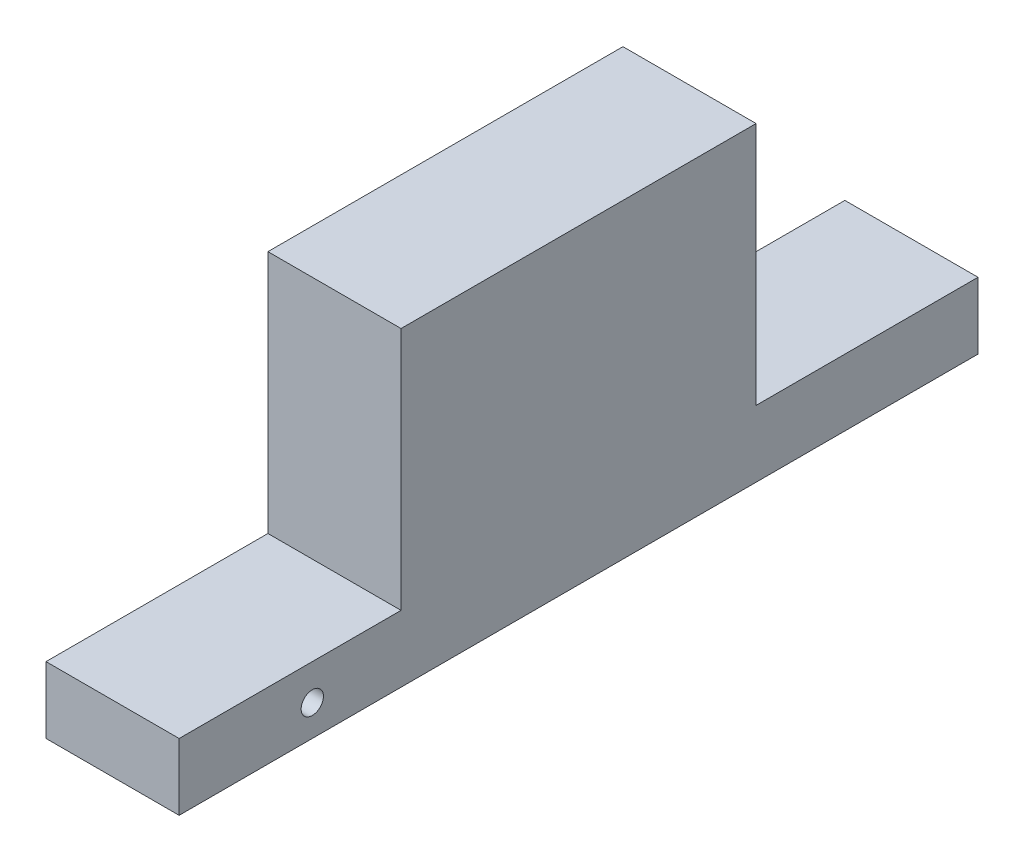
ISO-10303-21;
HEADER;
FILE_DESCRIPTION(('STEP AP214'),'2;1');
FILE_NAME('part.step','',(''),(''),'','','');
FILE_SCHEMA(('AUTOMOTIVE_DESIGN { 1 0 10303 214 1 1 1 1 }'));
ENDSEC;
DATA;
#1=APPLICATION_CONTEXT('core data for automotive mechanical design processes');
#2=APPLICATION_PROTOCOL_DEFINITION('international standard','automotive_design',2000,#1);
#3=PRODUCT_CONTEXT('',#1,'mechanical');
#4=PRODUCT('Part','Part','',(#3));
#5=PRODUCT_RELATED_PRODUCT_CATEGORY('part','',(#4));
#6=PRODUCT_DEFINITION_FORMATION('','',#4);
#7=PRODUCT_DEFINITION_CONTEXT('part definition',#1,'design');
#8=PRODUCT_DEFINITION('design','',#6,#7);
#9=PRODUCT_DEFINITION_SHAPE('','',#8);
#10=(LENGTH_UNIT() NAMED_UNIT(*) SI_UNIT(.MILLI.,.METRE.));
#11=(NAMED_UNIT(*) PLANE_ANGLE_UNIT() SI_UNIT($,.RADIAN.));
#12=(NAMED_UNIT(*) SI_UNIT($,.STERADIAN.) SOLID_ANGLE_UNIT());
#13=UNCERTAINTY_MEASURE_WITH_UNIT(LENGTH_MEASURE(1.E-05),#10,'distance_accuracy_value','');
#14=(GEOMETRIC_REPRESENTATION_CONTEXT(3) GLOBAL_UNCERTAINTY_ASSIGNED_CONTEXT((#13)) GLOBAL_UNIT_ASSIGNED_CONTEXT((#10,
#11,#12)) REPRESENTATION_CONTEXT('',''));
#15=CARTESIAN_POINT('',(0.,0.,0.));
#16=DIRECTION('',(0.,0.,1.));
#17=DIRECTION('',(1.,0.,0.));
#18=AXIS2_PLACEMENT_3D('',#15,#16,#17);
#19=CARTESIAN_POINT('',(208.132079158251,-35.000000000025,400000.));
#20=DIRECTION('',(0.,1.,0.));
#21=DIRECTION('',(0.,0.,1.));
#22=AXIS2_PLACEMENT_3D('',#19,#20,#21);
#23=PLANE('',#22);
#24=DIRECTION('',(0.,0.,-1.));
#25=VECTOR('',#24,1.);
#26=CARTESIAN_POINT('',(15.,-35.000000000025,400000.));
#27=LINE('',#26,#25);
#28=CARTESIAN_POINT('',(15.,-35.000000000025,89.999999999975));
#29=VERTEX_POINT('',#28);
#30=CARTESIAN_POINT('',(15.0000000000001,-35.000000000025,-89.999999999975));
#31=VERTEX_POINT('',#30);
#32=EDGE_CURVE('E131',#29,#31,#27,.T.);
#33=ORIENTED_EDGE('',*,*,#32,.F.);
#34=DIRECTION('',(-1.,0.,0.));
#35=VECTOR('',#34,1.);
#36=CARTESIAN_POINT('',(208.132079158251,-35.000000000025,89.999999999975));
#37=LINE('',#36,#35);
#38=CARTESIAN_POINT('',(-15.,-35.000000000025,89.999999999975));
#39=VERTEX_POINT('',#38);
#40=EDGE_CURVE('E36',#29,#39,#37,.T.);
#41=ORIENTED_EDGE('',*,*,#40,.T.);
#42=DIRECTION('',(0.,0.,-1.));
#43=VECTOR('',#42,1.);
#44=CARTESIAN_POINT('',(-15.,-35.000000000025,400000.));
#45=LINE('',#44,#43);
#46=CARTESIAN_POINT('',(-15.,-35.000000000025,-89.999999999975));
#47=VERTEX_POINT('',#46);
#48=EDGE_CURVE('E139',#39,#47,#45,.T.);
#49=ORIENTED_EDGE('',*,*,#48,.T.);
#50=DIRECTION('',(-1.,0.,0.));
#51=VECTOR('',#50,1.);
#52=CARTESIAN_POINT('',(208.132079158251,-35.000000000025,-89.999999999975));
#53=LINE('',#52,#51);
#54=EDGE_CURVE('E87',#31,#47,#53,.T.);
#55=ORIENTED_EDGE('',*,*,#54,.F.);
#56=EDGE_LOOP('',(#33,#41,#49,#55));
#57=FACE_BOUND('',#56,.T.);
#58=ADVANCED_FACE('F32',(#57),#23,.F.);
#59=CARTESIAN_POINT('',(208.132079158251,-291545.,-89.999999999975));
#60=DIRECTION('',(0.,0.,1.));
#61=DIRECTION('',(1.,0.,0.));
#62=AXIS2_PLACEMENT_3D('',#59,#60,#61);
#63=PLANE('',#62);
#64=DIRECTION('',(0.,1.,0.));
#65=VECTOR('',#64,1.);
#66=CARTESIAN_POINT('',(15.,-291545.,-89.999999999975));
#67=LINE('',#66,#65);
#68=CARTESIAN_POINT('',(15.0000000000001,-19.9999999999831,-89.999999999975));
#69=VERTEX_POINT('',#68);
#70=EDGE_CURVE('E94',#31,#69,#67,.T.);
#71=ORIENTED_EDGE('',*,*,#70,.F.);
#72=ORIENTED_EDGE('',*,*,#54,.T.);
#73=DIRECTION('',(0.,1.,0.));
#74=VECTOR('',#73,1.);
#75=CARTESIAN_POINT('',(-15.,-291545.,-89.999999999975));
#76=LINE('',#75,#74);
#77=CARTESIAN_POINT('',(-15.,-19.9999999999831,-89.999999999975));
#78=VERTEX_POINT('',#77);
#79=EDGE_CURVE('E138',#47,#78,#76,.T.);
#80=ORIENTED_EDGE('',*,*,#79,.T.);
#81=DIRECTION('',(-1.,0.,0.));
#82=VECTOR('',#81,1.);
#83=CARTESIAN_POINT('',(208.132079158251,-19.9999999999831,-89.999999999975));
#84=LINE('',#83,#82);
#85=EDGE_CURVE('E140',#69,#78,#84,.T.);
#86=ORIENTED_EDGE('',*,*,#85,.F.);
#87=EDGE_LOOP('',(#71,#72,#80,#86));
#88=FACE_BOUND('',#87,.T.);
#89=ADVANCED_FACE('F187',(#88),#63,.F.);
#90=CARTESIAN_POINT('',(208.132079158251,-20.0000000000387,400000.));
#91=DIRECTION('',(0.,-1.,0.));
#92=DIRECTION('',(0.,0.,-1.));
#93=AXIS2_PLACEMENT_3D('',#90,#91,#92);
#94=PLANE('',#93);
#95=DIRECTION('',(0.,0.,1.));
#96=VECTOR('',#95,1.);
#97=CARTESIAN_POINT('',(15.,-20.0000000000387,400000.));
#98=LINE('',#97,#96);
#99=CARTESIAN_POINT('',(15.0000000000001,-19.9999999999818,-40.0000000000405));
#100=VERTEX_POINT('',#99);
#101=EDGE_CURVE('E127',#69,#100,#98,.T.);
#102=ORIENTED_EDGE('',*,*,#101,.F.);
#103=ORIENTED_EDGE('',*,*,#85,.T.);
#104=DIRECTION('',(0.,0.,1.));
#105=VECTOR('',#104,1.);
#106=CARTESIAN_POINT('',(-15.,-20.0000000000387,400000.));
#107=LINE('',#106,#105);
#108=CARTESIAN_POINT('',(-15.,-19.9999999999818,-40.0000000000405));
#109=VERTEX_POINT('',#108);
#110=EDGE_CURVE('E142',#78,#109,#107,.T.);
#111=ORIENTED_EDGE('',*,*,#110,.T.);
#112=DIRECTION('',(-1.,0.,0.));
#113=VECTOR('',#112,1.);
#114=CARTESIAN_POINT('',(208.132079158251,-19.9999999999818,-40.0000000000405));
#115=LINE('',#114,#113);
#116=EDGE_CURVE('E143',#100,#109,#115,.T.);
#117=ORIENTED_EDGE('',*,*,#116,.F.);
#118=EDGE_LOOP('',(#102,#103,#111,#117));
#119=FACE_BOUND('',#118,.T.);
#120=ADVANCED_FACE('F191',(#119),#94,.F.);
#121=CARTESIAN_POINT('',(208.132079158251,-291545.,-40.0000000000773));
#122=DIRECTION('',(0.,0.,1.));
#123=DIRECTION('',(0.,-1.,0.));
#124=AXIS2_PLACEMENT_3D('',#121,#122,#123);
#125=PLANE('',#124);
#126=DIRECTION('',(0.,1.,0.));
#127=VECTOR('',#126,1.);
#128=CARTESIAN_POINT('',(15.,-291545.,-40.0000000000773));
#129=LINE('',#128,#127);
#130=CARTESIAN_POINT('',(15.0000000000001,35.000000000025,-40.0000000000205));
#131=VERTEX_POINT('',#130);
#132=EDGE_CURVE('E122',#100,#131,#129,.T.);
#133=ORIENTED_EDGE('',*,*,#132,.F.);
#134=ORIENTED_EDGE('',*,*,#116,.T.);
#135=DIRECTION('',(0.,1.,0.));
#136=VECTOR('',#135,1.);
#137=CARTESIAN_POINT('',(-15.,-291545.,-40.0000000000773));
#138=LINE('',#137,#136);
#139=CARTESIAN_POINT('',(-15.,35.000000000025,-40.0000000000205));
#140=VERTEX_POINT('',#139);
#141=EDGE_CURVE('E145',#109,#140,#138,.T.);
#142=ORIENTED_EDGE('',*,*,#141,.T.);
#143=DIRECTION('',(-1.,0.,0.));
#144=VECTOR('',#143,1.);
#145=CARTESIAN_POINT('',(208.132079158251,35.000000000025,-40.0000000000205));
#146=LINE('',#145,#144);
#147=EDGE_CURVE('E146',#131,#140,#146,.T.);
#148=ORIENTED_EDGE('',*,*,#147,.F.);
#149=EDGE_LOOP('',(#133,#134,#142,#148));
#150=FACE_BOUND('',#149,.T.);
#151=ADVANCED_FACE('F196',(#150),#125,.F.);
#152=CARTESIAN_POINT('',(208.132079158251,35.000000000025,400000.));
#153=DIRECTION('',(0.,-1.,0.));
#154=DIRECTION('',(0.,0.,-1.));
#155=AXIS2_PLACEMENT_3D('',#152,#153,#154);
#156=PLANE('',#155);
#157=DIRECTION('',(0.,0.,1.));
#158=VECTOR('',#157,1.);
#159=CARTESIAN_POINT('',(15.,35.000000000025,400000.));
#160=LINE('',#159,#158);
#161=CARTESIAN_POINT('',(15.0000000000001,35.000000000025,40.0000000000405));
#162=VERTEX_POINT('',#161);
#163=EDGE_CURVE('E120',#131,#162,#160,.T.);
#164=ORIENTED_EDGE('',*,*,#163,.F.);
#165=ORIENTED_EDGE('',*,*,#147,.T.);
#166=DIRECTION('',(0.,0.,1.));
#167=VECTOR('',#166,1.);
#168=CARTESIAN_POINT('',(-15.,35.000000000025,400000.));
#169=LINE('',#168,#167);
#170=CARTESIAN_POINT('',(-15.,35.000000000025,40.0000000000405));
#171=VERTEX_POINT('',#170);
#172=EDGE_CURVE('E148',#140,#171,#169,.T.);
#173=ORIENTED_EDGE('',*,*,#172,.T.);
#174=DIRECTION('',(-1.,0.,0.));
#175=VECTOR('',#174,1.);
#176=CARTESIAN_POINT('',(208.132079158251,35.000000000025,40.0000000000405));
#177=LINE('',#176,#175);
#178=EDGE_CURVE('E149',#162,#171,#177,.T.);
#179=ORIENTED_EDGE('',*,*,#178,.F.);
#180=EDGE_LOOP('',(#164,#165,#173,#179));
#181=FACE_BOUND('',#180,.T.);
#182=ADVANCED_FACE('F200',(#181),#156,.F.);
#183=CARTESIAN_POINT('',(208.132079158251,-291545.,40.0000000000773));
#184=DIRECTION('',(0.,0.,-1.));
#185=DIRECTION('',(0.,1.,0.));
#186=AXIS2_PLACEMENT_3D('',#183,#184,#185);
#187=PLANE('',#186);
#188=DIRECTION('',(0.,-1.,0.));
#189=VECTOR('',#188,1.);
#190=CARTESIAN_POINT('',(15.,-291545.,40.0000000000773));
#191=LINE('',#190,#189);
#192=CARTESIAN_POINT('',(15.0000000000001,-19.9999999999818,40.0000000000205));
#193=VERTEX_POINT('',#192);
#194=EDGE_CURVE('E41',#162,#193,#191,.T.);
#195=ORIENTED_EDGE('',*,*,#194,.F.);
#196=ORIENTED_EDGE('',*,*,#178,.T.);
#197=DIRECTION('',(0.,-1.,0.));
#198=VECTOR('',#197,1.);
#199=CARTESIAN_POINT('',(-15.,-291545.,40.0000000000773));
#200=LINE('',#199,#198);
#201=CARTESIAN_POINT('',(-15.,-19.9999999999818,40.0000000000205));
#202=VERTEX_POINT('',#201);
#203=EDGE_CURVE('E114',#171,#202,#200,.T.);
#204=ORIENTED_EDGE('',*,*,#203,.T.);
#205=DIRECTION('',(-1.,0.,0.));
#206=VECTOR('',#205,1.);
#207=CARTESIAN_POINT('',(208.132079158251,-19.9999999999818,40.0000000000205));
#208=LINE('',#207,#206);
#209=EDGE_CURVE('E105',#193,#202,#208,.T.);
#210=ORIENTED_EDGE('',*,*,#209,.F.);
#211=EDGE_LOOP('',(#195,#196,#204,#210));
#212=FACE_BOUND('',#211,.T.);
#213=ADVANCED_FACE('F111',(#212),#187,.F.);
#214=CARTESIAN_POINT('',(208.132079158251,-19.9999999999818,400000.));
#215=DIRECTION('',(0.,-1.,0.));
#216=DIRECTION('',(0.,0.,-1.));
#217=AXIS2_PLACEMENT_3D('',#214,#215,#216);
#218=PLANE('',#217);
#219=DIRECTION('',(0.,0.,1.));
#220=VECTOR('',#219,1.);
#221=CARTESIAN_POINT('',(15.,-19.9999999999818,400000.));
#222=LINE('',#221,#220);
#223=CARTESIAN_POINT('',(15.0000000000001,-19.9999999999818,89.999999999975));
#224=VERTEX_POINT('',#223);
#225=EDGE_CURVE('E11',#193,#224,#222,.T.);
#226=ORIENTED_EDGE('',*,*,#225,.F.);
#227=ORIENTED_EDGE('',*,*,#209,.T.);
#228=DIRECTION('',(0.,0.,1.));
#229=VECTOR('',#228,1.);
#230=CARTESIAN_POINT('',(-15.,-19.9999999999818,400000.));
#231=LINE('',#230,#229);
#232=CARTESIAN_POINT('',(-15.,-19.9999999999818,89.999999999975));
#233=VERTEX_POINT('',#232);
#234=EDGE_CURVE('E116',#202,#233,#231,.T.);
#235=ORIENTED_EDGE('',*,*,#234,.T.);
#236=DIRECTION('',(-1.,0.,0.));
#237=VECTOR('',#236,1.);
#238=CARTESIAN_POINT('',(208.132079158251,-19.9999999999818,89.999999999975));
#239=LINE('',#238,#237);
#240=EDGE_CURVE('E54',#224,#233,#239,.T.);
#241=ORIENTED_EDGE('',*,*,#240,.F.);
#242=EDGE_LOOP('',(#226,#227,#235,#241));
#243=FACE_BOUND('',#242,.T.);
#244=ADVANCED_FACE('F104',(#243),#218,.F.);
#245=CARTESIAN_POINT('',(208.132079158251,-291545.,89.999999999975));
#246=DIRECTION('',(0.,0.,-1.));
#247=DIRECTION('',(-1.,0.,0.));
#248=AXIS2_PLACEMENT_3D('',#245,#246,#247);
#249=PLANE('',#248);
#250=DIRECTION('',(0.,-1.,0.));
#251=VECTOR('',#250,1.);
#252=CARTESIAN_POINT('',(15.,-291545.,89.999999999975));
#253=LINE('',#252,#251);
#254=EDGE_CURVE('E134',#224,#29,#253,.T.);
#255=ORIENTED_EDGE('',*,*,#254,.F.);
#256=ORIENTED_EDGE('',*,*,#240,.T.);
#257=DIRECTION('',(0.,-1.,0.));
#258=VECTOR('',#257,1.);
#259=CARTESIAN_POINT('',(-15.,-291545.,89.999999999975));
#260=LINE('',#259,#258);
#261=EDGE_CURVE('E136',#233,#39,#260,.T.);
#262=ORIENTED_EDGE('',*,*,#261,.T.);
#263=ORIENTED_EDGE('',*,*,#40,.F.);
#264=EDGE_LOOP('',(#255,#256,#262,#263));
#265=FACE_BOUND('',#264,.T.);
#266=ADVANCED_FACE('F184',(#265),#249,.F.);
#267=CARTESIAN_POINT('',(-15.,0.,0.));
#268=DIRECTION('',(1.,0.,0.));
#269=DIRECTION('',(0.,0.,-1.));
#270=AXIS2_PLACEMENT_3D('',#267,#268,#269);
#271=PLANE('',#270);
#272=CARTESIAN_POINT('',(-15.,-28.,60.));
#273=DIRECTION('',(1.,0.,0.));
#274=DIRECTION('',(0.,0.,-1.));
#275=AXIS2_PLACEMENT_3D('',#272,#273,#274);
#276=CIRCLE('',#275,2.51);
#277=CARTESIAN_POINT('',(-15.,-28.,57.49));
#278=VERTEX_POINT('',#277);
#279=EDGE_CURVE('E165',#278,#278,#276,.T.);
#280=ORIENTED_EDGE('',*,*,#279,.T.);
#281=EDGE_LOOP('',(#280));
#282=FACE_BOUND('',#281,.T.);
#283=ORIENTED_EDGE('',*,*,#48,.F.);
#284=ORIENTED_EDGE('',*,*,#261,.F.);
#285=ORIENTED_EDGE('',*,*,#234,.F.);
#286=ORIENTED_EDGE('',*,*,#203,.F.);
#287=ORIENTED_EDGE('',*,*,#172,.F.);
#288=ORIENTED_EDGE('',*,*,#141,.F.);
#289=ORIENTED_EDGE('',*,*,#110,.F.);
#290=ORIENTED_EDGE('',*,*,#79,.F.);
#291=EDGE_LOOP('',(#283,#284,#285,#286,#287,#288,#289,#290));
#292=FACE_BOUND('',#291,.T.);
#293=ADVANCED_FACE('F177',(#282,#292),#271,.F.);
#294=CARTESIAN_POINT('',(15.,0.,0.));
#295=DIRECTION('',(1.,0.,0.));
#296=DIRECTION('',(0.,0.,-1.));
#297=AXIS2_PLACEMENT_3D('',#294,#295,#296);
#298=PLANE('',#297);
#299=CARTESIAN_POINT('',(15.0000000000001,-28.,60.));
#300=DIRECTION('',(1.,0.,0.));
#301=DIRECTION('',(0.,0.,-1.));
#302=AXIS2_PLACEMENT_3D('',#299,#300,#301);
#303=CIRCLE('',#302,2.51);
#304=CARTESIAN_POINT('',(15.0000000000001,-28.,57.49));
#305=VERTEX_POINT('',#304);
#306=EDGE_CURVE('E167',#305,#305,#303,.T.);
#307=ORIENTED_EDGE('',*,*,#306,.F.);
#308=EDGE_LOOP('',(#307));
#309=FACE_BOUND('',#308,.T.);
#310=ORIENTED_EDGE('',*,*,#254,.T.);
#311=ORIENTED_EDGE('',*,*,#32,.T.);
#312=ORIENTED_EDGE('',*,*,#70,.T.);
#313=ORIENTED_EDGE('',*,*,#101,.T.);
#314=ORIENTED_EDGE('',*,*,#132,.T.);
#315=ORIENTED_EDGE('',*,*,#163,.T.);
#316=ORIENTED_EDGE('',*,*,#194,.T.);
#317=ORIENTED_EDGE('',*,*,#225,.T.);
#318=EDGE_LOOP('',(#310,#311,#312,#313,#314,#315,#316,#317));
#319=FACE_BOUND('',#318,.T.);
#320=ADVANCED_FACE('F34',(#309,#319),#298,.T.);
#321=CARTESIAN_POINT('',(-15.,-28.,60.));
#322=DIRECTION('',(1.,0.,0.));
#323=DIRECTION('',(0.,0.,-1.));
#324=AXIS2_PLACEMENT_3D('',#321,#322,#323);
#325=CYLINDRICAL_SURFACE('',#324,2.51);
#326=ORIENTED_EDGE('',*,*,#279,.F.);
#327=EDGE_LOOP('',(#326));
#328=FACE_BOUND('',#327,.T.);
#329=ORIENTED_EDGE('',*,*,#306,.T.);
#330=EDGE_LOOP('',(#329));
#331=FACE_BOUND('',#330,.T.);
#332=ADVANCED_FACE('F174',(#328,#331),#325,.F.);
#333=CLOSED_SHELL('',(#58,#89,#120,#151,#182,#213,#244,#266,#293,#320,#332));
#334=MANIFOLD_SOLID_BREP('B2',#333);
#335=ADVANCED_BREP_SHAPE_REPRESENTATION('',(#18,#334),#14);
#336=SHAPE_DEFINITION_REPRESENTATION(#9,#335);
ENDSEC;
END-ISO-10303-21;
